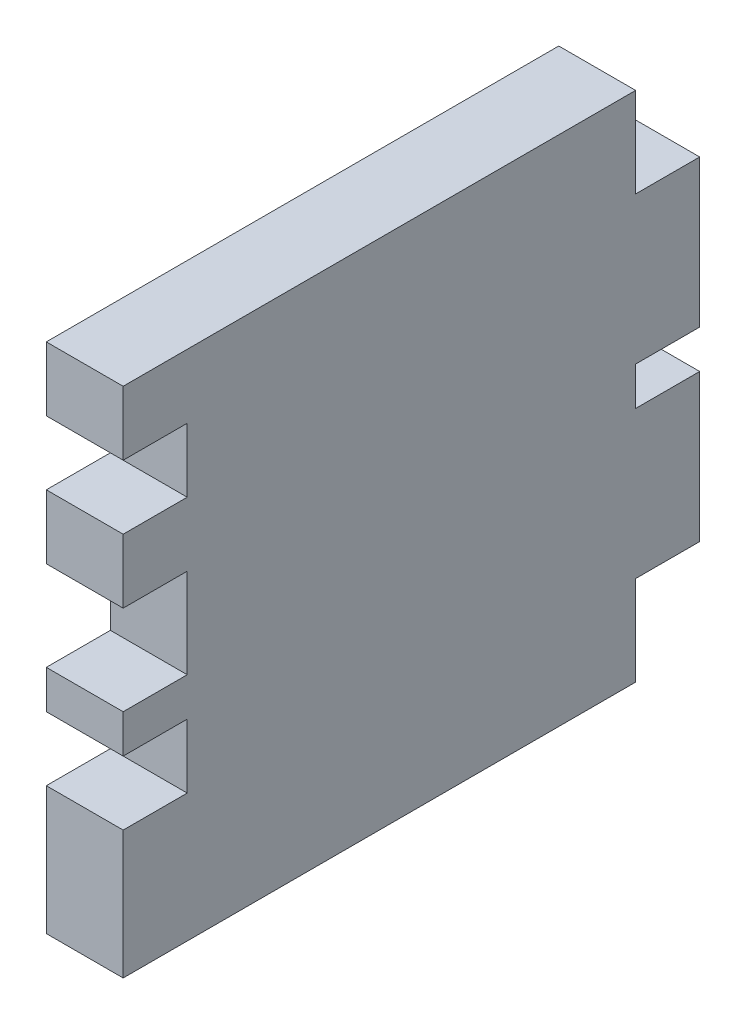
ISO-10303-21;
HEADER;
FILE_DESCRIPTION(('STEP AP214'),'2;1');
FILE_NAME('part.step','',(''),(''),'','','');
FILE_SCHEMA(('AUTOMOTIVE_DESIGN { 1 0 10303 214 1 1 1 1 }'));
ENDSEC;
DATA;
#1=APPLICATION_CONTEXT('core data for automotive mechanical design processes');
#2=APPLICATION_PROTOCOL_DEFINITION('international standard','automotive_design',2000,#1);
#3=PRODUCT_CONTEXT('',#1,'mechanical');
#4=PRODUCT('Part','Part','',(#3));
#5=PRODUCT_RELATED_PRODUCT_CATEGORY('part','',(#4));
#6=PRODUCT_DEFINITION_FORMATION('','',#4);
#7=PRODUCT_DEFINITION_CONTEXT('part definition',#1,'design');
#8=PRODUCT_DEFINITION('design','',#6,#7);
#9=PRODUCT_DEFINITION_SHAPE('','',#8);
#10=(LENGTH_UNIT() NAMED_UNIT(*) SI_UNIT(.MILLI.,.METRE.));
#11=(NAMED_UNIT(*) PLANE_ANGLE_UNIT() SI_UNIT($,.RADIAN.));
#12=(NAMED_UNIT(*) SI_UNIT($,.STERADIAN.) SOLID_ANGLE_UNIT());
#13=UNCERTAINTY_MEASURE_WITH_UNIT(LENGTH_MEASURE(1.E-05),#10,'distance_accuracy_value','');
#14=(GEOMETRIC_REPRESENTATION_CONTEXT(3) GLOBAL_UNCERTAINTY_ASSIGNED_CONTEXT((#13)) GLOBAL_UNIT_ASSIGNED_CONTEXT((#10,
#11,#12)) REPRESENTATION_CONTEXT('',''));
#15=CARTESIAN_POINT('',(0.,0.,0.));
#16=DIRECTION('',(0.,0.,1.));
#17=DIRECTION('',(1.,0.,0.));
#18=AXIS2_PLACEMENT_3D('',#15,#16,#17);
#19=CARTESIAN_POINT('',(6.,16.7553191489362,-22.5797872340426));
#20=DIRECTION('',(0.,0.,1.));
#21=DIRECTION('',(1.,0.,0.));
#22=AXIS2_PLACEMENT_3D('',#19,#20,#21);
#23=PLANE('',#22);
#24=DIRECTION('',(1.,0.,0.));
#25=VECTOR('',#24,1.);
#26=CARTESIAN_POINT('',(0.,9.75531914893617,-22.5797872340426));
#27=LINE('',#26,#25);
#28=CARTESIAN_POINT('',(0.,9.75531914893617,-22.5797872340426));
#29=VERTEX_POINT('',#28);
#30=CARTESIAN_POINT('',(6.,9.75531914893617,-22.5797872340426));
#31=VERTEX_POINT('',#30);
#32=EDGE_CURVE('E200',#29,#31,#27,.T.);
#33=ORIENTED_EDGE('',*,*,#32,.T.);
#34=DIRECTION('',(0.,1.,0.));
#35=VECTOR('',#34,1.);
#36=CARTESIAN_POINT('',(6.,16.7553191489362,-22.5797872340426));
#37=LINE('',#36,#35);
#38=CARTESIAN_POINT('',(6.,-1.74468085106383,-22.5797872340426));
#39=VERTEX_POINT('',#38);
#40=EDGE_CURVE('E233',#39,#31,#37,.T.);
#41=ORIENTED_EDGE('',*,*,#40,.F.);
#42=DIRECTION('',(1.,0.,0.));
#43=VECTOR('',#42,1.);
#44=CARTESIAN_POINT('',(0.,-1.74468085106383,-22.5797872340426));
#45=LINE('',#44,#43);
#46=CARTESIAN_POINT('',(0.,-1.74468085106383,-22.5797872340426));
#47=VERTEX_POINT('',#46);
#48=EDGE_CURVE('E251',#47,#39,#45,.T.);
#49=ORIENTED_EDGE('',*,*,#48,.F.);
#50=DIRECTION('',(0.,1.,0.));
#51=VECTOR('',#50,1.);
#52=CARTESIAN_POINT('',(0.,16.7553191489362,-22.5797872340426));
#53=LINE('',#52,#51);
#54=EDGE_CURVE('E223',#47,#29,#53,.T.);
#55=ORIENTED_EDGE('',*,*,#54,.T.);
#56=EDGE_LOOP('',(#33,#41,#49,#55));
#57=FACE_BOUND('',#56,.T.);
#58=ADVANCED_FACE('F33',(#57),#23,.F.);
#59=CARTESIAN_POINT('',(0.,-16.2446808510638,-22.5797872340426));
#60=VERTEX_POINT('',#59);
#61=CARTESIAN_POINT('',(0.,-4.74468085106383,-22.5797872340426));
#62=VERTEX_POINT('',#61);
#63=EDGE_CURVE('E217',#60,#62,#53,.T.);
#64=ORIENTED_EDGE('',*,*,#63,.T.);
#65=DIRECTION('',(1.,0.,0.));
#66=VECTOR('',#65,1.);
#67=CARTESIAN_POINT('',(0.,-4.74468085106383,-22.5797872340426));
#68=LINE('',#67,#66);
#69=CARTESIAN_POINT('',(6.,-4.74468085106383,-22.5797872340426));
#70=VERTEX_POINT('',#69);
#71=EDGE_CURVE('E266',#62,#70,#68,.T.);
#72=ORIENTED_EDGE('',*,*,#71,.T.);
#73=CARTESIAN_POINT('',(6.,-16.2446808510638,-22.5797872340426));
#74=VERTEX_POINT('',#73);
#75=EDGE_CURVE('E228',#74,#70,#37,.T.);
#76=ORIENTED_EDGE('',*,*,#75,.F.);
#77=DIRECTION('',(1.,0.,0.));
#78=VECTOR('',#77,1.);
#79=CARTESIAN_POINT('',(0.,-16.2446808510638,-22.5797872340426));
#80=LINE('',#79,#78);
#81=EDGE_CURVE('E287',#60,#74,#80,.T.);
#82=ORIENTED_EDGE('',*,*,#81,.F.);
#83=EDGE_LOOP('',(#64,#72,#76,#82));
#84=FACE_BOUND('',#83,.T.);
#85=ADVANCED_FACE('F395',(#84),#23,.F.);
#86=CARTESIAN_POINT('',(6.,0.,0.));
#87=DIRECTION('',(1.,0.,0.));
#88=DIRECTION('',(0.,0.,-1.));
#89=AXIS2_PLACEMENT_3D('',#86,#87,#88);
#90=PLANE('',#89);
#91=ORIENTED_EDGE('',*,*,#40,.T.);
#92=DIRECTION('',(0.,0.,1.));
#93=VECTOR('',#92,1.);
#94=CARTESIAN_POINT('',(6.,9.75531914893617,-22.5797872340426));
#95=LINE('',#94,#93);
#96=CARTESIAN_POINT('',(6.,9.75531914893617,-17.5797872340426));
#97=VERTEX_POINT('',#96);
#98=EDGE_CURVE('E257',#31,#97,#95,.T.);
#99=ORIENTED_EDGE('',*,*,#98,.T.);
#100=DIRECTION('',(0.,-1.,0.));
#101=VECTOR('',#100,1.);
#102=CARTESIAN_POINT('',(6.,16.7553191489362,-17.5797872340426));
#103=LINE('',#102,#101);
#104=CARTESIAN_POINT('',(6.,16.7553191489362,-17.5797872340426));
#105=VERTEX_POINT('',#104);
#106=EDGE_CURVE('E255',#105,#97,#103,.T.);
#107=ORIENTED_EDGE('',*,*,#106,.F.);
#108=DIRECTION('',(0.,0.,1.));
#109=VECTOR('',#108,1.);
#110=CARTESIAN_POINT('',(6.,16.7553191489362,22.4202127659574));
#111=LINE('',#110,#109);
#112=CARTESIAN_POINT('',(6.,16.7553191489362,22.4202127659574));
#113=VERTEX_POINT('',#112);
#114=EDGE_CURVE('E209',#105,#113,#111,.T.);
#115=ORIENTED_EDGE('',*,*,#114,.T.);
#116=DIRECTION('',(0.,-1.,0.));
#117=VECTOR('',#116,1.);
#118=CARTESIAN_POINT('',(6.,16.7553191489362,22.4202127659574));
#119=LINE('',#118,#117);
#120=CARTESIAN_POINT('',(6.,11.7553191489362,22.4202127659574));
#121=VERTEX_POINT('',#120);
#122=EDGE_CURVE('E221',#113,#121,#119,.T.);
#123=ORIENTED_EDGE('',*,*,#122,.T.);
#124=DIRECTION('',(0.,0.,-1.));
#125=VECTOR('',#124,1.);
#126=CARTESIAN_POINT('',(6.,11.7553191489362,22.4202127659574));
#127=LINE('',#126,#125);
#128=CARTESIAN_POINT('',(6.,11.7553191489362,17.4202127659574));
#129=VERTEX_POINT('',#128);
#130=EDGE_CURVE('E306',#121,#129,#127,.T.);
#131=ORIENTED_EDGE('',*,*,#130,.T.);
#132=DIRECTION('',(0.,-1.,0.));
#133=VECTOR('',#132,1.);
#134=CARTESIAN_POINT('',(6.,11.7553191489362,17.4202127659574));
#135=LINE('',#134,#133);
#136=CARTESIAN_POINT('',(6.,6.75531914893617,17.4202127659574));
#137=VERTEX_POINT('',#136);
#138=EDGE_CURVE('E315',#129,#137,#135,.T.);
#139=ORIENTED_EDGE('',*,*,#138,.T.);
#140=DIRECTION('',(0.,0.,-1.));
#141=VECTOR('',#140,1.);
#142=CARTESIAN_POINT('',(6.,6.75531914893617,22.4202127659574));
#143=LINE('',#142,#141);
#144=CARTESIAN_POINT('',(6.,6.75531914893617,22.4202127659574));
#145=VERTEX_POINT('',#144);
#146=EDGE_CURVE('E312',#145,#137,#143,.T.);
#147=ORIENTED_EDGE('',*,*,#146,.F.);
#148=CARTESIAN_POINT('',(6.,1.75531914893617,22.4202127659574));
#149=VERTEX_POINT('',#148);
#150=EDGE_CURVE('E379',#145,#149,#119,.T.);
#151=ORIENTED_EDGE('',*,*,#150,.T.);
#152=DIRECTION('',(0.,0.,-1.));
#153=VECTOR('',#152,1.);
#154=CARTESIAN_POINT('',(6.,1.75531914893617,22.4202127659574));
#155=LINE('',#154,#153);
#156=CARTESIAN_POINT('',(6.,1.75531914893617,17.4202127659575));
#157=VERTEX_POINT('',#156);
#158=EDGE_CURVE('E340',#149,#157,#155,.T.);
#159=ORIENTED_EDGE('',*,*,#158,.T.);
#160=DIRECTION('',(0.,-1.,0.));
#161=VECTOR('',#160,1.);
#162=CARTESIAN_POINT('',(6.,1.75531914893617,17.4202127659575));
#163=LINE('',#162,#161);
#164=CARTESIAN_POINT('',(6.,-5.24468085106383,17.4202127659575));
#165=VERTEX_POINT('',#164);
#166=EDGE_CURVE('E343',#157,#165,#163,.T.);
#167=ORIENTED_EDGE('',*,*,#166,.T.);
#168=DIRECTION('',(0.,0.,-1.));
#169=VECTOR('',#168,1.);
#170=CARTESIAN_POINT('',(6.,-5.24468085106384,22.4202127659574));
#171=LINE('',#170,#169);
#172=CARTESIAN_POINT('',(6.,-5.24468085106384,22.4202127659574));
#173=VERTEX_POINT('',#172);
#174=EDGE_CURVE('E316',#173,#165,#171,.T.);
#175=ORIENTED_EDGE('',*,*,#174,.F.);
#176=CARTESIAN_POINT('',(6.,-8.24468085106384,22.4202127659574));
#177=VERTEX_POINT('',#176);
#178=EDGE_CURVE('E219',#173,#177,#119,.T.);
#179=ORIENTED_EDGE('',*,*,#178,.T.);
#180=DIRECTION('',(0.,0.,-1.));
#181=VECTOR('',#180,1.);
#182=CARTESIAN_POINT('',(6.,-8.24468085106384,22.4202127659574));
#183=LINE('',#182,#181);
#184=CARTESIAN_POINT('',(6.,-8.24468085106384,17.4202127659574));
#185=VERTEX_POINT('',#184);
#186=EDGE_CURVE('E364',#177,#185,#183,.T.);
#187=ORIENTED_EDGE('',*,*,#186,.T.);
#188=DIRECTION('',(0.,-1.,0.));
#189=VECTOR('',#188,1.);
#190=CARTESIAN_POINT('',(6.,-8.24468085106384,17.4202127659574));
#191=LINE('',#190,#189);
#192=CARTESIAN_POINT('',(6.,-13.2446808510638,17.4202127659574));
#193=VERTEX_POINT('',#192);
#194=EDGE_CURVE('E367',#185,#193,#191,.T.);
#195=ORIENTED_EDGE('',*,*,#194,.T.);
#196=DIRECTION('',(0.,0.,-1.));
#197=VECTOR('',#196,1.);
#198=CARTESIAN_POINT('',(6.,-13.2446808510638,22.4202127659574));
#199=LINE('',#198,#197);
#200=CARTESIAN_POINT('',(6.,-13.2446808510638,22.4202127659574));
#201=VERTEX_POINT('',#200);
#202=EDGE_CURVE('E339',#201,#193,#199,.T.);
#203=ORIENTED_EDGE('',*,*,#202,.F.);
#204=CARTESIAN_POINT('',(6.,-23.2446808510638,22.4202127659574));
#205=VERTEX_POINT('',#204);
#206=EDGE_CURVE('E216',#201,#205,#119,.T.);
#207=ORIENTED_EDGE('',*,*,#206,.T.);
#208=DIRECTION('',(0.,0.,-1.));
#209=VECTOR('',#208,1.);
#210=CARTESIAN_POINT('',(6.,-23.2446808510638,22.4202127659574));
#211=LINE('',#210,#209);
#212=CARTESIAN_POINT('',(6.,-23.2446808510638,-17.5797872340426));
#213=VERTEX_POINT('',#212);
#214=EDGE_CURVE('E378',#205,#213,#211,.T.);
#215=ORIENTED_EDGE('',*,*,#214,.T.);
#216=DIRECTION('',(0.,-1.,0.));
#217=VECTOR('',#216,1.);
#218=CARTESIAN_POINT('',(6.,-16.2446808510638,-17.5797872340426));
#219=LINE('',#218,#217);
#220=CARTESIAN_POINT('',(6.,-16.2446808510638,-17.5797872340426));
#221=VERTEX_POINT('',#220);
#222=EDGE_CURVE('E294',#221,#213,#219,.T.);
#223=ORIENTED_EDGE('',*,*,#222,.F.);
#224=DIRECTION('',(0.,0.,-1.));
#225=VECTOR('',#224,1.);
#226=CARTESIAN_POINT('',(6.,-16.2446808510638,-17.5797872340426));
#227=LINE('',#226,#225);
#228=EDGE_CURVE('E274',#221,#74,#227,.T.);
#229=ORIENTED_EDGE('',*,*,#228,.T.);
#230=ORIENTED_EDGE('',*,*,#75,.T.);
#231=DIRECTION('',(0.,0.,-1.));
#232=VECTOR('',#231,1.);
#233=CARTESIAN_POINT('',(6.,-4.74468085106383,-17.5797872340426));
#234=LINE('',#233,#232);
#235=CARTESIAN_POINT('',(6.,-4.74468085106383,-17.5797872340426));
#236=VERTEX_POINT('',#235);
#237=EDGE_CURVE('E261',#236,#70,#234,.T.);
#238=ORIENTED_EDGE('',*,*,#237,.F.);
#239=DIRECTION('',(0.,-1.,0.));
#240=VECTOR('',#239,1.);
#241=CARTESIAN_POINT('',(6.,-1.74468085106383,-17.5797872340426));
#242=LINE('',#241,#240);
#243=CARTESIAN_POINT('',(6.,-1.74468085106383,-17.5797872340426));
#244=VERTEX_POINT('',#243);
#245=EDGE_CURVE('E275',#244,#236,#242,.T.);
#246=ORIENTED_EDGE('',*,*,#245,.F.);
#247=DIRECTION('',(0.,0.,-1.));
#248=VECTOR('',#247,1.);
#249=CARTESIAN_POINT('',(6.,-1.74468085106383,-17.5797872340426));
#250=LINE('',#249,#248);
#251=EDGE_CURVE('E278',#244,#39,#250,.T.);
#252=ORIENTED_EDGE('',*,*,#251,.T.);
#253=EDGE_LOOP('',(#91,#99,#107,#115,#123,#131,#139,#147,#151,#159,#167,#175,#179,#187,#195,
#203,#207,#215,#223,#229,#230,#238,#246,#252));
#254=FACE_BOUND('',#253,.T.);
#255=ADVANCED_FACE('F383',(#254),#90,.T.);
#256=CARTESIAN_POINT('',(0.,0.,0.));
#257=DIRECTION('',(1.,0.,0.));
#258=DIRECTION('',(0.,0.,-1.));
#259=AXIS2_PLACEMENT_3D('',#256,#257,#258);
#260=PLANE('',#259);
#261=DIRECTION('',(0.,0.,1.));
#262=VECTOR('',#261,1.);
#263=CARTESIAN_POINT('',(0.,9.75531914893617,-22.5797872340426));
#264=LINE('',#263,#262);
#265=CARTESIAN_POINT('',(0.,9.75531914893617,-17.5797872340426));
#266=VERTEX_POINT('',#265);
#267=EDGE_CURVE('E201',#29,#266,#264,.T.);
#268=ORIENTED_EDGE('',*,*,#267,.F.);
#269=ORIENTED_EDGE('',*,*,#54,.F.);
#270=DIRECTION('',(0.,0.,-1.));
#271=VECTOR('',#270,1.);
#272=CARTESIAN_POINT('',(0.,-1.74468085106383,-17.5797872340426));
#273=LINE('',#272,#271);
#274=CARTESIAN_POINT('',(0.,-1.74468085106383,-17.5797872340426));
#275=VERTEX_POINT('',#274);
#276=EDGE_CURVE('E253',#275,#47,#273,.T.);
#277=ORIENTED_EDGE('',*,*,#276,.F.);
#278=DIRECTION('',(0.,-1.,0.));
#279=VECTOR('',#278,1.);
#280=CARTESIAN_POINT('',(0.,-1.74468085106383,-17.5797872340426));
#281=LINE('',#280,#279);
#282=CARTESIAN_POINT('',(0.,-4.74468085106383,-17.5797872340426));
#283=VERTEX_POINT('',#282);
#284=EDGE_CURVE('E56',#275,#283,#281,.T.);
#285=ORIENTED_EDGE('',*,*,#284,.T.);
#286=DIRECTION('',(0.,0.,-1.));
#287=VECTOR('',#286,1.);
#288=CARTESIAN_POINT('',(0.,-4.74468085106383,-17.5797872340426));
#289=LINE('',#288,#287);
#290=EDGE_CURVE('E279',#283,#62,#289,.T.);
#291=ORIENTED_EDGE('',*,*,#290,.T.);
#292=ORIENTED_EDGE('',*,*,#63,.F.);
#293=DIRECTION('',(0.,0.,-1.));
#294=VECTOR('',#293,1.);
#295=CARTESIAN_POINT('',(0.,-16.2446808510638,-17.5797872340426));
#296=LINE('',#295,#294);
#297=CARTESIAN_POINT('',(0.,-16.2446808510638,-17.5797872340426));
#298=VERTEX_POINT('',#297);
#299=EDGE_CURVE('E296',#298,#60,#296,.T.);
#300=ORIENTED_EDGE('',*,*,#299,.F.);
#301=DIRECTION('',(0.,-1.,0.));
#302=VECTOR('',#301,1.);
#303=CARTESIAN_POINT('',(0.,-16.2446808510638,-17.5797872340426));
#304=LINE('',#303,#302);
#305=CARTESIAN_POINT('',(0.,-23.2446808510638,-17.5797872340426));
#306=VERTEX_POINT('',#305);
#307=EDGE_CURVE('E289',#298,#306,#304,.T.);
#308=ORIENTED_EDGE('',*,*,#307,.T.);
#309=DIRECTION('',(0.,0.,-1.));
#310=VECTOR('',#309,1.);
#311=CARTESIAN_POINT('',(0.,-23.2446808510638,22.4202127659574));
#312=LINE('',#311,#310);
#313=CARTESIAN_POINT('',(0.,-23.2446808510638,22.4202127659574));
#314=VERTEX_POINT('',#313);
#315=EDGE_CURVE('E237',#314,#306,#312,.T.);
#316=ORIENTED_EDGE('',*,*,#315,.F.);
#317=DIRECTION('',(0.,-1.,0.));
#318=VECTOR('',#317,1.);
#319=CARTESIAN_POINT('',(0.,16.7553191489362,22.4202127659574));
#320=LINE('',#319,#318);
#321=CARTESIAN_POINT('',(0.,-13.2446808510638,22.4202127659574));
#322=VERTEX_POINT('',#321);
#323=EDGE_CURVE('E239',#322,#314,#320,.T.);
#324=ORIENTED_EDGE('',*,*,#323,.F.);
#325=DIRECTION('',(0.,0.,-1.));
#326=VECTOR('',#325,1.);
#327=CARTESIAN_POINT('',(0.,-13.2446808510638,22.4202127659574));
#328=LINE('',#327,#326);
#329=CARTESIAN_POINT('',(0.,-13.2446808510638,17.4202127659574));
#330=VERTEX_POINT('',#329);
#331=EDGE_CURVE('E368',#322,#330,#328,.T.);
#332=ORIENTED_EDGE('',*,*,#331,.T.);
#333=DIRECTION('',(0.,-1.,0.));
#334=VECTOR('',#333,1.);
#335=CARTESIAN_POINT('',(0.,-8.24468085106384,17.4202127659574));
#336=LINE('',#335,#334);
#337=CARTESIAN_POINT('',(0.,-8.24468085106384,17.4202127659574));
#338=VERTEX_POINT('',#337);
#339=EDGE_CURVE('E375',#338,#330,#336,.T.);
#340=ORIENTED_EDGE('',*,*,#339,.F.);
#341=DIRECTION('',(0.,0.,-1.));
#342=VECTOR('',#341,1.);
#343=CARTESIAN_POINT('',(0.,-8.24468085106384,22.4202127659574));
#344=LINE('',#343,#342);
#345=CARTESIAN_POINT('',(0.,-8.24468085106384,22.4202127659574));
#346=VERTEX_POINT('',#345);
#347=EDGE_CURVE('E357',#346,#338,#344,.T.);
#348=ORIENTED_EDGE('',*,*,#347,.F.);
#349=CARTESIAN_POINT('',(0.,-5.24468085106384,22.4202127659574));
#350=VERTEX_POINT('',#349);
#351=EDGE_CURVE('E411',#350,#346,#320,.T.);
#352=ORIENTED_EDGE('',*,*,#351,.F.);
#353=DIRECTION('',(0.,0.,-1.));
#354=VECTOR('',#353,1.);
#355=CARTESIAN_POINT('',(0.,-5.24468085106384,22.4202127659574));
#356=LINE('',#355,#354);
#357=CARTESIAN_POINT('',(0.,-5.24468085106383,17.4202127659575));
#358=VERTEX_POINT('',#357);
#359=EDGE_CURVE('E344',#350,#358,#356,.T.);
#360=ORIENTED_EDGE('',*,*,#359,.T.);
#361=DIRECTION('',(0.,-1.,0.));
#362=VECTOR('',#361,1.);
#363=CARTESIAN_POINT('',(0.,1.75531914893617,17.4202127659575));
#364=LINE('',#363,#362);
#365=CARTESIAN_POINT('',(0.,1.75531914893617,17.4202127659575));
#366=VERTEX_POINT('',#365);
#367=EDGE_CURVE('E351',#366,#358,#364,.T.);
#368=ORIENTED_EDGE('',*,*,#367,.F.);
#369=DIRECTION('',(0.,0.,-1.));
#370=VECTOR('',#369,1.);
#371=CARTESIAN_POINT('',(0.,1.75531914893617,22.4202127659574));
#372=LINE('',#371,#370);
#373=CARTESIAN_POINT('',(0.,1.75531914893617,22.4202127659574));
#374=VERTEX_POINT('',#373);
#375=EDGE_CURVE('E331',#374,#366,#372,.T.);
#376=ORIENTED_EDGE('',*,*,#375,.F.);
#377=CARTESIAN_POINT('',(0.,6.75531914893617,22.4202127659574));
#378=VERTEX_POINT('',#377);
#379=EDGE_CURVE('E238',#378,#374,#320,.T.);
#380=ORIENTED_EDGE('',*,*,#379,.F.);
#381=DIRECTION('',(0.,0.,-1.));
#382=VECTOR('',#381,1.);
#383=CARTESIAN_POINT('',(0.,6.75531914893617,22.4202127659574));
#384=LINE('',#383,#382);
#385=CARTESIAN_POINT('',(0.,6.75531914893617,17.4202127659574));
#386=VERTEX_POINT('',#385);
#387=EDGE_CURVE('E302',#378,#386,#384,.T.);
#388=ORIENTED_EDGE('',*,*,#387,.T.);
#389=DIRECTION('',(0.,-1.,0.));
#390=VECTOR('',#389,1.);
#391=CARTESIAN_POINT('',(0.,11.7553191489362,17.4202127659574));
#392=LINE('',#391,#390);
#393=CARTESIAN_POINT('',(0.,11.7553191489362,17.4202127659574));
#394=VERTEX_POINT('',#393);
#395=EDGE_CURVE('E305',#394,#386,#392,.T.);
#396=ORIENTED_EDGE('',*,*,#395,.F.);
#397=DIRECTION('',(0.,0.,-1.));
#398=VECTOR('',#397,1.);
#399=CARTESIAN_POINT('',(0.,11.7553191489362,22.4202127659574));
#400=LINE('',#399,#398);
#401=CARTESIAN_POINT('',(0.,11.7553191489362,22.4202127659574));
#402=VERTEX_POINT('',#401);
#403=EDGE_CURVE('E308',#402,#394,#400,.T.);
#404=ORIENTED_EDGE('',*,*,#403,.F.);
#405=CARTESIAN_POINT('',(0.,16.7553191489362,22.4202127659574));
#406=VERTEX_POINT('',#405);
#407=EDGE_CURVE('E215',#406,#402,#320,.T.);
#408=ORIENTED_EDGE('',*,*,#407,.F.);
#409=DIRECTION('',(0.,0.,1.));
#410=VECTOR('',#409,1.);
#411=CARTESIAN_POINT('',(0.,16.7553191489362,22.4202127659574));
#412=LINE('',#411,#410);
#413=CARTESIAN_POINT('',(0.,16.7553191489362,-17.5797872340426));
#414=VERTEX_POINT('',#413);
#415=EDGE_CURVE('E207',#414,#406,#412,.T.);
#416=ORIENTED_EDGE('',*,*,#415,.F.);
#417=DIRECTION('',(0.,-1.,0.));
#418=VECTOR('',#417,1.);
#419=CARTESIAN_POINT('',(0.,16.7553191489362,-17.5797872340426));
#420=LINE('',#419,#418);
#421=EDGE_CURVE('E192',#414,#266,#420,.T.);
#422=ORIENTED_EDGE('',*,*,#421,.T.);
#423=EDGE_LOOP('',(#268,#269,#277,#285,#291,#292,#300,#308,#316,#324,#332,#340,#348,#352,#360,
#368,#376,#380,#388,#396,#404,#408,#416,#422));
#424=FACE_BOUND('',#423,.T.);
#425=ADVANCED_FACE('F212',(#424),#260,.F.);
#426=CARTESIAN_POINT('',(6.,16.7553191489362,22.4202127659574));
#427=DIRECTION('',(0.,0.,-1.));
#428=DIRECTION('',(0.,1.,0.));
#429=AXIS2_PLACEMENT_3D('',#426,#427,#428);
#430=PLANE('',#429);
#431=DIRECTION('',(1.,0.,0.));
#432=VECTOR('',#431,1.);
#433=CARTESIAN_POINT('',(0.,11.7553191489362,22.4202127659574));
#434=LINE('',#433,#432);
#435=EDGE_CURVE('E323',#402,#121,#434,.T.);
#436=ORIENTED_EDGE('',*,*,#435,.T.);
#437=ORIENTED_EDGE('',*,*,#122,.F.);
#438=DIRECTION('',(-1.,0.,0.));
#439=VECTOR('',#438,1.);
#440=CARTESIAN_POINT('',(6.,16.7553191489362,22.4202127659574));
#441=LINE('',#440,#439);
#442=EDGE_CURVE('E41',#113,#406,#441,.T.);
#443=ORIENTED_EDGE('',*,*,#442,.T.);
#444=ORIENTED_EDGE('',*,*,#407,.T.);
#445=EDGE_LOOP('',(#436,#437,#443,#444));
#446=FACE_BOUND('',#445,.T.);
#447=ADVANCED_FACE('F465',(#446),#430,.F.);
#448=ORIENTED_EDGE('',*,*,#150,.F.);
#449=DIRECTION('',(1.,0.,0.));
#450=VECTOR('',#449,1.);
#451=CARTESIAN_POINT('',(0.,6.75531914893617,22.4202127659574));
#452=LINE('',#451,#450);
#453=EDGE_CURVE('E321',#378,#145,#452,.T.);
#454=ORIENTED_EDGE('',*,*,#453,.F.);
#455=ORIENTED_EDGE('',*,*,#379,.T.);
#456=DIRECTION('',(1.,0.,0.));
#457=VECTOR('',#456,1.);
#458=CARTESIAN_POINT('',(0.,1.75531914893617,22.4202127659574));
#459=LINE('',#458,#457);
#460=EDGE_CURVE('E334',#374,#149,#459,.T.);
#461=ORIENTED_EDGE('',*,*,#460,.T.);
#462=EDGE_LOOP('',(#448,#454,#455,#461));
#463=FACE_BOUND('',#462,.T.);
#464=ADVANCED_FACE('F421',(#463),#430,.F.);
#465=ORIENTED_EDGE('',*,*,#178,.F.);
#466=DIRECTION('',(1.,0.,0.));
#467=VECTOR('',#466,1.);
#468=CARTESIAN_POINT('',(0.,-5.24468085106384,22.4202127659574));
#469=LINE('',#468,#467);
#470=EDGE_CURVE('E337',#350,#173,#469,.T.);
#471=ORIENTED_EDGE('',*,*,#470,.F.);
#472=ORIENTED_EDGE('',*,*,#351,.T.);
#473=DIRECTION('',(1.,0.,0.));
#474=VECTOR('',#473,1.);
#475=CARTESIAN_POINT('',(0.,-8.24468085106384,22.4202127659574));
#476=LINE('',#475,#474);
#477=EDGE_CURVE('E360',#346,#177,#476,.T.);
#478=ORIENTED_EDGE('',*,*,#477,.T.);
#479=EDGE_LOOP('',(#465,#471,#472,#478));
#480=FACE_BOUND('',#479,.T.);
#481=ADVANCED_FACE('F433',(#480),#430,.F.);
#482=ORIENTED_EDGE('',*,*,#206,.F.);
#483=DIRECTION('',(1.,0.,0.));
#484=VECTOR('',#483,1.);
#485=CARTESIAN_POINT('',(0.,-13.2446808510638,22.4202127659574));
#486=LINE('',#485,#484);
#487=EDGE_CURVE('E265',#322,#201,#486,.T.);
#488=ORIENTED_EDGE('',*,*,#487,.F.);
#489=ORIENTED_EDGE('',*,*,#323,.T.);
#490=DIRECTION('',(-1.,0.,0.));
#491=VECTOR('',#490,1.);
#492=CARTESIAN_POINT('',(6.,-23.2446808510638,22.4202127659574));
#493=LINE('',#492,#491);
#494=EDGE_CURVE('E11',#205,#314,#493,.T.);
#495=ORIENTED_EDGE('',*,*,#494,.F.);
#496=EDGE_LOOP('',(#482,#488,#489,#495));
#497=FACE_BOUND('',#496,.T.);
#498=ADVANCED_FACE('F35',(#497),#430,.F.);
#499=CARTESIAN_POINT('',(6.,-23.2446808510638,22.4202127659574));
#500=DIRECTION('',(0.,1.,0.));
#501=DIRECTION('',(0.,0.,1.));
#502=AXIS2_PLACEMENT_3D('',#499,#500,#501);
#503=PLANE('',#502);
#504=ORIENTED_EDGE('',*,*,#315,.T.);
#505=DIRECTION('',(1.,0.,0.));
#506=VECTOR('',#505,1.);
#507=CARTESIAN_POINT('',(0.,-23.2446808510638,-17.5797872340426));
#508=LINE('',#507,#506);
#509=EDGE_CURVE('E292',#306,#213,#508,.T.);
#510=ORIENTED_EDGE('',*,*,#509,.T.);
#511=ORIENTED_EDGE('',*,*,#214,.F.);
#512=ORIENTED_EDGE('',*,*,#494,.T.);
#513=EDGE_LOOP('',(#504,#510,#511,#512));
#514=FACE_BOUND('',#513,.T.);
#515=ADVANCED_FACE('F405',(#514),#503,.F.);
#516=CARTESIAN_POINT('',(6.,16.7553191489362,22.4202127659574));
#517=DIRECTION('',(0.,-1.,0.));
#518=DIRECTION('',(0.,0.,-1.));
#519=AXIS2_PLACEMENT_3D('',#516,#517,#518);
#520=PLANE('',#519);
#521=ORIENTED_EDGE('',*,*,#114,.F.);
#522=DIRECTION('',(1.,0.,0.));
#523=VECTOR('',#522,1.);
#524=CARTESIAN_POINT('',(0.,16.7553191489362,-17.5797872340426));
#525=LINE('',#524,#523);
#526=EDGE_CURVE('E195',#414,#105,#525,.T.);
#527=ORIENTED_EDGE('',*,*,#526,.F.);
#528=ORIENTED_EDGE('',*,*,#415,.T.);
#529=ORIENTED_EDGE('',*,*,#442,.F.);
#530=EDGE_LOOP('',(#521,#527,#528,#529));
#531=FACE_BOUND('',#530,.T.);
#532=ADVANCED_FACE('F205',(#531),#520,.F.);
#533=CARTESIAN_POINT('',(0.,-13.2446808510638,22.4202127659574));
#534=DIRECTION('',(0.,-1.,0.));
#535=DIRECTION('',(0.,0.,-1.));
#536=AXIS2_PLACEMENT_3D('',#533,#534,#535);
#537=PLANE('',#536);
#538=ORIENTED_EDGE('',*,*,#202,.T.);
#539=DIRECTION('',(1.,0.,0.));
#540=VECTOR('',#539,1.);
#541=CARTESIAN_POINT('',(0.,-13.2446808510638,17.4202127659574));
#542=LINE('',#541,#540);
#543=EDGE_CURVE('E355',#330,#193,#542,.T.);
#544=ORIENTED_EDGE('',*,*,#543,.F.);
#545=ORIENTED_EDGE('',*,*,#331,.F.);
#546=ORIENTED_EDGE('',*,*,#487,.T.);
#547=EDGE_LOOP('',(#538,#544,#545,#546));
#548=FACE_BOUND('',#547,.T.);
#549=ADVANCED_FACE('F443',(#548),#537,.F.);
#550=CARTESIAN_POINT('',(0.,-8.24468085106384,22.4202127659574));
#551=DIRECTION('',(0.,-1.,0.));
#552=DIRECTION('',(0.,0.,-1.));
#553=AXIS2_PLACEMENT_3D('',#550,#551,#552);
#554=PLANE('',#553);
#555=ORIENTED_EDGE('',*,*,#186,.F.);
#556=ORIENTED_EDGE('',*,*,#477,.F.);
#557=ORIENTED_EDGE('',*,*,#347,.T.);
#558=DIRECTION('',(1.,0.,0.));
#559=VECTOR('',#558,1.);
#560=CARTESIAN_POINT('',(0.,-8.24468085106384,17.4202127659574));
#561=LINE('',#560,#559);
#562=EDGE_CURVE('E358',#338,#185,#561,.T.);
#563=ORIENTED_EDGE('',*,*,#562,.T.);
#564=EDGE_LOOP('',(#555,#556,#557,#563));
#565=FACE_BOUND('',#564,.T.);
#566=ADVANCED_FACE('F436',(#565),#554,.T.);
#567=CARTESIAN_POINT('',(0.,-8.24468085106384,17.4202127659574));
#568=DIRECTION('',(0.,0.,1.));
#569=DIRECTION('',(0.,-1.,0.));
#570=AXIS2_PLACEMENT_3D('',#567,#568,#569);
#571=PLANE('',#570);
#572=ORIENTED_EDGE('',*,*,#194,.F.);
#573=ORIENTED_EDGE('',*,*,#562,.F.);
#574=ORIENTED_EDGE('',*,*,#339,.T.);
#575=ORIENTED_EDGE('',*,*,#543,.T.);
#576=EDGE_LOOP('',(#572,#573,#574,#575));
#577=FACE_BOUND('',#576,.T.);
#578=ADVANCED_FACE('F441',(#577),#571,.T.);
#579=CARTESIAN_POINT('',(0.,-5.24468085106384,22.4202127659574));
#580=DIRECTION('',(0.,-1.,0.));
#581=DIRECTION('',(0.,0.,-1.));
#582=AXIS2_PLACEMENT_3D('',#579,#580,#581);
#583=PLANE('',#582);
#584=ORIENTED_EDGE('',*,*,#174,.T.);
#585=DIRECTION('',(1.,0.,0.));
#586=VECTOR('',#585,1.);
#587=CARTESIAN_POINT('',(0.,-5.24468085106383,17.4202127659575));
#588=LINE('',#587,#586);
#589=EDGE_CURVE('E329',#358,#165,#588,.T.);
#590=ORIENTED_EDGE('',*,*,#589,.F.);
#591=ORIENTED_EDGE('',*,*,#359,.F.);
#592=ORIENTED_EDGE('',*,*,#470,.T.);
#593=EDGE_LOOP('',(#584,#590,#591,#592));
#594=FACE_BOUND('',#593,.T.);
#595=ADVANCED_FACE('F494',(#594),#583,.F.);
#596=CARTESIAN_POINT('',(0.,1.75531914893617,22.4202127659574));
#597=DIRECTION('',(0.,-1.,0.));
#598=DIRECTION('',(0.,0.,-1.));
#599=AXIS2_PLACEMENT_3D('',#596,#597,#598);
#600=PLANE('',#599);
#601=ORIENTED_EDGE('',*,*,#158,.F.);
#602=ORIENTED_EDGE('',*,*,#460,.F.);
#603=ORIENTED_EDGE('',*,*,#375,.T.);
#604=DIRECTION('',(1.,0.,0.));
#605=VECTOR('',#604,1.);
#606=CARTESIAN_POINT('',(0.,1.75531914893617,17.4202127659575));
#607=LINE('',#606,#605);
#608=EDGE_CURVE('E332',#366,#157,#607,.T.);
#609=ORIENTED_EDGE('',*,*,#608,.T.);
#610=EDGE_LOOP('',(#601,#602,#603,#609));
#611=FACE_BOUND('',#610,.T.);
#612=ADVANCED_FACE('F427',(#611),#600,.T.);
#613=CARTESIAN_POINT('',(0.,1.75531914893617,17.4202127659575));
#614=DIRECTION('',(0.,0.,1.));
#615=DIRECTION('',(1.,0.,0.));
#616=AXIS2_PLACEMENT_3D('',#613,#614,#615);
#617=PLANE('',#616);
#618=ORIENTED_EDGE('',*,*,#166,.F.);
#619=ORIENTED_EDGE('',*,*,#608,.F.);
#620=ORIENTED_EDGE('',*,*,#367,.T.);
#621=ORIENTED_EDGE('',*,*,#589,.T.);
#622=EDGE_LOOP('',(#618,#619,#620,#621));
#623=FACE_BOUND('',#622,.T.);
#624=ADVANCED_FACE('F483',(#623),#617,.T.);
#625=CARTESIAN_POINT('',(0.,6.75531914893617,22.4202127659574));
#626=DIRECTION('',(0.,-1.,0.));
#627=DIRECTION('',(0.,0.,-1.));
#628=AXIS2_PLACEMENT_3D('',#625,#626,#627);
#629=PLANE('',#628);
#630=ORIENTED_EDGE('',*,*,#146,.T.);
#631=DIRECTION('',(1.,0.,0.));
#632=VECTOR('',#631,1.);
#633=CARTESIAN_POINT('',(0.,6.75531914893617,17.4202127659574));
#634=LINE('',#633,#632);
#635=EDGE_CURVE('E311',#386,#137,#634,.T.);
#636=ORIENTED_EDGE('',*,*,#635,.F.);
#637=ORIENTED_EDGE('',*,*,#387,.F.);
#638=ORIENTED_EDGE('',*,*,#453,.T.);
#639=EDGE_LOOP('',(#630,#636,#637,#638));
#640=FACE_BOUND('',#639,.T.);
#641=ADVANCED_FACE('F481',(#640),#629,.F.);
#642=CARTESIAN_POINT('',(0.,11.7553191489362,22.4202127659574));
#643=DIRECTION('',(0.,-1.,0.));
#644=DIRECTION('',(0.,0.,-1.));
#645=AXIS2_PLACEMENT_3D('',#642,#643,#644);
#646=PLANE('',#645);
#647=ORIENTED_EDGE('',*,*,#130,.F.);
#648=ORIENTED_EDGE('',*,*,#435,.F.);
#649=ORIENTED_EDGE('',*,*,#403,.T.);
#650=DIRECTION('',(1.,0.,0.));
#651=VECTOR('',#650,1.);
#652=CARTESIAN_POINT('',(0.,11.7553191489362,17.4202127659574));
#653=LINE('',#652,#651);
#654=EDGE_CURVE('E326',#394,#129,#653,.T.);
#655=ORIENTED_EDGE('',*,*,#654,.T.);
#656=EDGE_LOOP('',(#647,#648,#649,#655));
#657=FACE_BOUND('',#656,.T.);
#658=ADVANCED_FACE('F476',(#657),#646,.T.);
#659=CARTESIAN_POINT('',(0.,11.7553191489362,17.4202127659574));
#660=DIRECTION('',(0.,0.,1.));
#661=DIRECTION('',(1.,0.,0.));
#662=AXIS2_PLACEMENT_3D('',#659,#660,#661);
#663=PLANE('',#662);
#664=ORIENTED_EDGE('',*,*,#138,.F.);
#665=ORIENTED_EDGE('',*,*,#654,.F.);
#666=ORIENTED_EDGE('',*,*,#395,.T.);
#667=ORIENTED_EDGE('',*,*,#635,.T.);
#668=EDGE_LOOP('',(#664,#665,#666,#667));
#669=FACE_BOUND('',#668,.T.);
#670=ADVANCED_FACE('F478',(#669),#663,.T.);
#671=CARTESIAN_POINT('',(0.,-16.2446808510638,-17.5797872340426));
#672=DIRECTION('',(0.,0.,1.));
#673=DIRECTION('',(0.,-1.,0.));
#674=AXIS2_PLACEMENT_3D('',#671,#672,#673);
#675=PLANE('',#674);
#676=ORIENTED_EDGE('',*,*,#222,.T.);
#677=ORIENTED_EDGE('',*,*,#509,.F.);
#678=ORIENTED_EDGE('',*,*,#307,.F.);
#679=DIRECTION('',(1.,0.,0.));
#680=VECTOR('',#679,1.);
#681=CARTESIAN_POINT('',(0.,-16.2446808510638,-17.5797872340426));
#682=LINE('',#681,#680);
#683=EDGE_CURVE('E290',#298,#221,#682,.T.);
#684=ORIENTED_EDGE('',*,*,#683,.T.);
#685=EDGE_LOOP('',(#676,#677,#678,#684));
#686=FACE_BOUND('',#685,.T.);
#687=ADVANCED_FACE('F404',(#686),#675,.F.);
#688=CARTESIAN_POINT('',(0.,-16.2446808510638,-17.5797872340426));
#689=DIRECTION('',(0.,-1.,0.));
#690=DIRECTION('',(0.,0.,-1.));
#691=AXIS2_PLACEMENT_3D('',#688,#689,#690);
#692=PLANE('',#691);
#693=ORIENTED_EDGE('',*,*,#228,.F.);
#694=ORIENTED_EDGE('',*,*,#683,.F.);
#695=ORIENTED_EDGE('',*,*,#299,.T.);
#696=ORIENTED_EDGE('',*,*,#81,.T.);
#697=EDGE_LOOP('',(#693,#694,#695,#696));
#698=FACE_BOUND('',#697,.T.);
#699=ADVANCED_FACE('F402',(#698),#692,.T.);
#700=CARTESIAN_POINT('',(0.,-4.74468085106383,-17.5797872340426));
#701=DIRECTION('',(0.,-1.,0.));
#702=DIRECTION('',(0.,0.,-1.));
#703=AXIS2_PLACEMENT_3D('',#700,#701,#702);
#704=PLANE('',#703);
#705=ORIENTED_EDGE('',*,*,#237,.T.);
#706=ORIENTED_EDGE('',*,*,#71,.F.);
#707=ORIENTED_EDGE('',*,*,#290,.F.);
#708=DIRECTION('',(1.,0.,0.));
#709=VECTOR('',#708,1.);
#710=CARTESIAN_POINT('',(0.,-4.74468085106383,-17.5797872340426));
#711=LINE('',#710,#709);
#712=EDGE_CURVE('E272',#283,#236,#711,.T.);
#713=ORIENTED_EDGE('',*,*,#712,.T.);
#714=EDGE_LOOP('',(#705,#706,#707,#713));
#715=FACE_BOUND('',#714,.T.);
#716=ADVANCED_FACE('F393',(#715),#704,.F.);
#717=CARTESIAN_POINT('',(0.,-1.74468085106383,-17.5797872340426));
#718=DIRECTION('',(0.,0.,1.));
#719=DIRECTION('',(1.,0.,0.));
#720=AXIS2_PLACEMENT_3D('',#717,#718,#719);
#721=PLANE('',#720);
#722=ORIENTED_EDGE('',*,*,#245,.T.);
#723=ORIENTED_EDGE('',*,*,#712,.F.);
#724=ORIENTED_EDGE('',*,*,#284,.F.);
#725=DIRECTION('',(1.,0.,0.));
#726=VECTOR('',#725,1.);
#727=CARTESIAN_POINT('',(0.,-1.74468085106383,-17.5797872340426));
#728=LINE('',#727,#726);
#729=EDGE_CURVE('E270',#275,#244,#728,.T.);
#730=ORIENTED_EDGE('',*,*,#729,.T.);
#731=EDGE_LOOP('',(#722,#723,#724,#730));
#732=FACE_BOUND('',#731,.T.);
#733=ADVANCED_FACE('F389',(#732),#721,.F.);
#734=CARTESIAN_POINT('',(0.,-1.74468085106383,-17.5797872340426));
#735=DIRECTION('',(0.,-1.,0.));
#736=DIRECTION('',(0.,0.,-1.));
#737=AXIS2_PLACEMENT_3D('',#734,#735,#736);
#738=PLANE('',#737);
#739=ORIENTED_EDGE('',*,*,#251,.F.);
#740=ORIENTED_EDGE('',*,*,#729,.F.);
#741=ORIENTED_EDGE('',*,*,#276,.T.);
#742=ORIENTED_EDGE('',*,*,#48,.T.);
#743=EDGE_LOOP('',(#739,#740,#741,#742));
#744=FACE_BOUND('',#743,.T.);
#745=ADVANCED_FACE('F388',(#744),#738,.T.);
#746=CARTESIAN_POINT('',(0.,9.75531914893617,-22.5797872340426));
#747=DIRECTION('',(0.,1.,0.));
#748=DIRECTION('',(0.,0.,1.));
#749=AXIS2_PLACEMENT_3D('',#746,#747,#748);
#750=PLANE('',#749);
#751=ORIENTED_EDGE('',*,*,#98,.F.);
#752=ORIENTED_EDGE('',*,*,#32,.F.);
#753=ORIENTED_EDGE('',*,*,#267,.T.);
#754=DIRECTION('',(1.,0.,0.));
#755=VECTOR('',#754,1.);
#756=CARTESIAN_POINT('',(0.,9.75531914893617,-17.5797872340426));
#757=LINE('',#756,#755);
#758=EDGE_CURVE('E48',#266,#97,#757,.T.);
#759=ORIENTED_EDGE('',*,*,#758,.T.);
#760=EDGE_LOOP('',(#751,#752,#753,#759));
#761=FACE_BOUND('',#760,.T.);
#762=ADVANCED_FACE('F601',(#761),#750,.T.);
#763=CARTESIAN_POINT('',(0.,16.7553191489362,-17.5797872340426));
#764=DIRECTION('',(0.,0.,1.));
#765=DIRECTION('',(1.,0.,0.));
#766=AXIS2_PLACEMENT_3D('',#763,#764,#765);
#767=PLANE('',#766);
#768=ORIENTED_EDGE('',*,*,#106,.T.);
#769=ORIENTED_EDGE('',*,*,#758,.F.);
#770=ORIENTED_EDGE('',*,*,#421,.F.);
#771=ORIENTED_EDGE('',*,*,#526,.T.);
#772=EDGE_LOOP('',(#768,#769,#770,#771));
#773=FACE_BOUND('',#772,.T.);
#774=ADVANCED_FACE('F194',(#773),#767,.F.);
#775=CLOSED_SHELL('',(#58,#85,#255,#425,#447,#464,#481,#498,#515,#532,#549,#566,#578,#595,#612,
#624,#641,#658,#670,#687,#699,#716,#733,#745,#762,#774));
#776=MANIFOLD_SOLID_BREP('B2',#775);
#777=ADVANCED_BREP_SHAPE_REPRESENTATION('',(#18,#776),#14);
#778=SHAPE_DEFINITION_REPRESENTATION(#9,#777);
ENDSEC;
END-ISO-10303-21;
